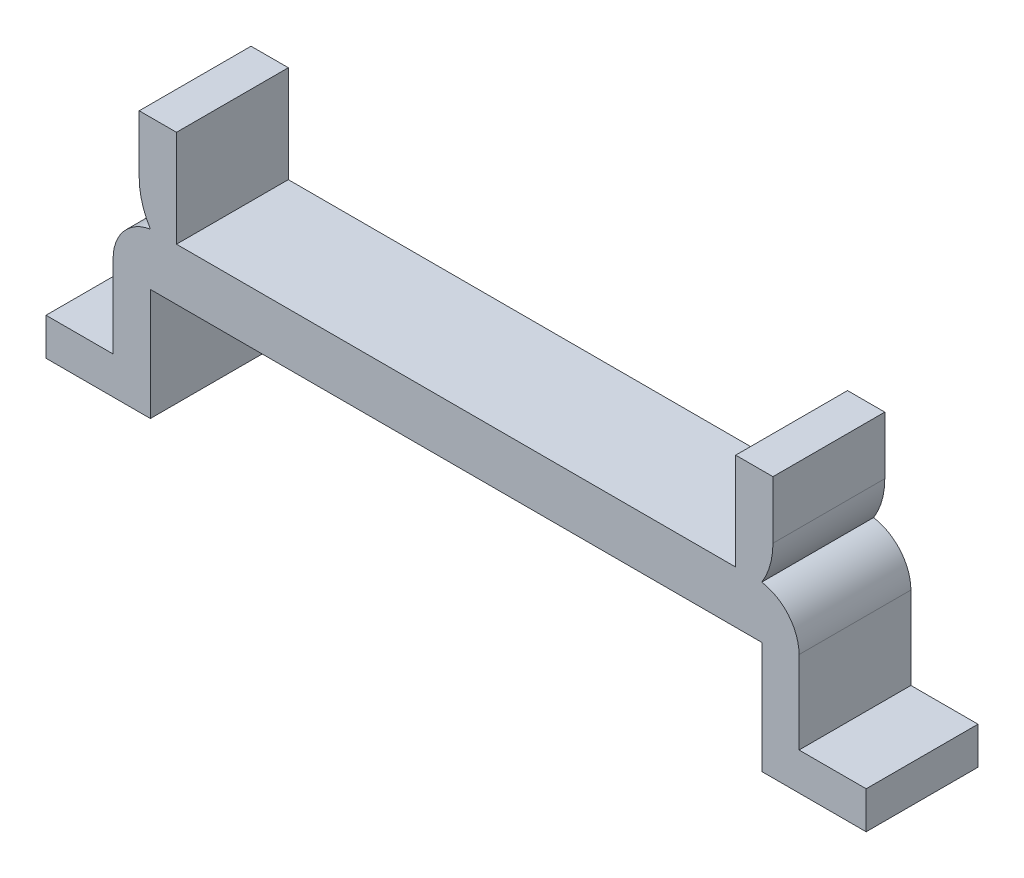
ISO-10303-21;
HEADER;
FILE_DESCRIPTION(('STEP AP214'),'2;1');
FILE_NAME('part.step','',(''),(''),'','','');
FILE_SCHEMA(('AUTOMOTIVE_DESIGN { 1 0 10303 214 1 1 1 1 }'));
ENDSEC;
DATA;
#1=APPLICATION_CONTEXT('core data for automotive mechanical design processes');
#2=APPLICATION_PROTOCOL_DEFINITION('international standard','automotive_design',2000,#1);
#3=PRODUCT_CONTEXT('',#1,'mechanical');
#4=PRODUCT('Part','Part','',(#3));
#5=PRODUCT_RELATED_PRODUCT_CATEGORY('part','',(#4));
#6=PRODUCT_DEFINITION_FORMATION('','',#4);
#7=PRODUCT_DEFINITION_CONTEXT('part definition',#1,'design');
#8=PRODUCT_DEFINITION('design','',#6,#7);
#9=PRODUCT_DEFINITION_SHAPE('','',#8);
#10=(LENGTH_UNIT() NAMED_UNIT(*) SI_UNIT(.MILLI.,.METRE.));
#11=(NAMED_UNIT(*) PLANE_ANGLE_UNIT() SI_UNIT($,.RADIAN.));
#12=(NAMED_UNIT(*) SI_UNIT($,.STERADIAN.) SOLID_ANGLE_UNIT());
#13=UNCERTAINTY_MEASURE_WITH_UNIT(LENGTH_MEASURE(1.E-05),#10,'distance_accuracy_value','');
#14=(GEOMETRIC_REPRESENTATION_CONTEXT(3) GLOBAL_UNCERTAINTY_ASSIGNED_CONTEXT((#13)) GLOBAL_UNIT_ASSIGNED_CONTEXT((#10,
#11,#12)) REPRESENTATION_CONTEXT('',''));
#15=CARTESIAN_POINT('',(0.,0.,0.));
#16=DIRECTION('',(0.,0.,1.));
#17=DIRECTION('',(1.,0.,0.));
#18=AXIS2_PLACEMENT_3D('',#15,#16,#17);
#19=CARTESIAN_POINT('',(-46.,7.,30.061028345357));
#20=DIRECTION('',(-1.,0.,0.));
#21=DIRECTION('',(0.,0.,1.));
#22=AXIS2_PLACEMENT_3D('',#19,#20,#21);
#23=PLANE('',#22);
#24=DIRECTION('',(0.,1.,0.));
#25=VECTOR('',#24,1.);
#26=CARTESIAN_POINT('',(-46.,7.,-7.5));
#27=LINE('',#26,#25);
#28=CARTESIAN_POINT('',(-46.,-10.,-7.5));
#29=VERTEX_POINT('',#28);
#30=CARTESIAN_POINT('',(-46.,1.08392021690038,-7.5));
#31=VERTEX_POINT('',#30);
#32=EDGE_CURVE('E238',#29,#31,#27,.T.);
#33=ORIENTED_EDGE('',*,*,#32,.F.);
#34=DIRECTION('',(0.,0.,-1.));
#35=VECTOR('',#34,1.);
#36=CARTESIAN_POINT('',(-46.,-10.,-7.5));
#37=LINE('',#36,#35);
#38=CARTESIAN_POINT('',(-46.,-10.,7.50000000000001));
#39=VERTEX_POINT('',#38);
#40=EDGE_CURVE('E196',#39,#29,#37,.T.);
#41=ORIENTED_EDGE('',*,*,#40,.F.);
#42=DIRECTION('',(0.,-1.,0.));
#43=VECTOR('',#42,1.);
#44=CARTESIAN_POINT('',(-46.,7.,7.50000000000001));
#45=LINE('',#44,#43);
#46=CARTESIAN_POINT('',(-46.,1.08392021690038,7.50000000000001));
#47=VERTEX_POINT('',#46);
#48=EDGE_CURVE('E239',#47,#39,#45,.T.);
#49=ORIENTED_EDGE('',*,*,#48,.F.);
#50=DIRECTION('',(0.,0.,1.));
#51=VECTOR('',#50,1.);
#52=CARTESIAN_POINT('',(-46.,1.08392021690038,-7.5));
#53=LINE('',#52,#51);
#54=EDGE_CURVE('E11',#47,#31,#53,.F.);
#55=ORIENTED_EDGE('',*,*,#54,.T.);
#56=EDGE_LOOP('',(#33,#41,#49,#55));
#57=FACE_BOUND('',#56,.T.);
#58=ADVANCED_FACE('F37',(#57),#23,.T.);
#59=CARTESIAN_POINT('',(0.,7.,0.));
#60=DIRECTION('',(0.,1.,0.));
#61=DIRECTION('',(0.,0.,1.));
#62=AXIS2_PLACEMENT_3D('',#59,#60,#61);
#63=PLANE('',#62);
#64=DIRECTION('',(1.,0.,0.));
#65=VECTOR('',#64,1.);
#66=CARTESIAN_POINT('',(-41.,7.,7.50000000000001));
#67=LINE('',#66,#65);
#68=CARTESIAN_POINT('',(-37.5,7.,7.50000000000001));
#69=VERTEX_POINT('',#68);
#70=CARTESIAN_POINT('',(37.5,7.,7.5));
#71=VERTEX_POINT('',#70);
#72=EDGE_CURVE('E314',#69,#71,#67,.T.);
#73=ORIENTED_EDGE('',*,*,#72,.T.);
#74=DIRECTION('',(0.,0.,1.));
#75=VECTOR('',#74,1.);
#76=CARTESIAN_POINT('',(37.5,7.,-7.5));
#77=LINE('',#76,#75);
#78=CARTESIAN_POINT('',(37.5,7.,-7.5));
#79=VERTEX_POINT('',#78);
#80=EDGE_CURVE('E275',#79,#71,#77,.T.);
#81=ORIENTED_EDGE('',*,*,#80,.F.);
#82=DIRECTION('',(-1.,0.,0.));
#83=VECTOR('',#82,1.);
#84=CARTESIAN_POINT('',(-41.,7.,-7.5));
#85=LINE('',#84,#83);
#86=CARTESIAN_POINT('',(-37.5,7.,-7.5));
#87=VERTEX_POINT('',#86);
#88=EDGE_CURVE('E320',#79,#87,#85,.T.);
#89=ORIENTED_EDGE('',*,*,#88,.T.);
#90=DIRECTION('',(0.,0.,-1.));
#91=VECTOR('',#90,1.);
#92=CARTESIAN_POINT('',(-37.5,7.,-7.5));
#93=LINE('',#92,#91);
#94=EDGE_CURVE('E278',#69,#87,#93,.T.);
#95=ORIENTED_EDGE('',*,*,#94,.F.);
#96=EDGE_LOOP('',(#73,#81,#89,#95));
#97=FACE_BOUND('',#96,.T.);
#98=ADVANCED_FACE('F378',(#97),#63,.T.);
#99=CARTESIAN_POINT('',(-41.,7.,7.50000000000001));
#100=DIRECTION('',(0.,0.,-1.));
#101=DIRECTION('',(-1.,0.,0.));
#102=AXIS2_PLACEMENT_3D('',#99,#100,#101);
#103=PLANE('',#102);
#104=DIRECTION('',(1.,0.,0.));
#105=VECTOR('',#104,1.);
#106=CARTESIAN_POINT('',(41.,-15.,7.5));
#107=LINE('',#106,#105);
#108=CARTESIAN_POINT('',(41.,-15.,7.5));
#109=VERTEX_POINT('',#108);
#110=CARTESIAN_POINT('',(55.,-15.,7.50000000000001));
#111=VERTEX_POINT('',#110);
#112=EDGE_CURVE('E251',#109,#111,#107,.T.);
#113=ORIENTED_EDGE('',*,*,#112,.T.);
#114=DIRECTION('',(0.,1.,0.));
#115=VECTOR('',#114,1.);
#116=CARTESIAN_POINT('',(55.,-15.,7.50000000000001));
#117=LINE('',#116,#115);
#118=CARTESIAN_POINT('',(55.,-10.,7.50000000000001));
#119=VERTEX_POINT('',#118);
#120=EDGE_CURVE('E209',#111,#119,#117,.T.);
#121=ORIENTED_EDGE('',*,*,#120,.T.);
#122=DIRECTION('',(-1.,0.,0.));
#123=VECTOR('',#122,1.);
#124=CARTESIAN_POINT('',(55.,-10.,7.50000000000001));
#125=LINE('',#124,#123);
#126=CARTESIAN_POINT('',(46.,-10.,7.5));
#127=VERTEX_POINT('',#126);
#128=EDGE_CURVE('E197',#119,#127,#125,.T.);
#129=ORIENTED_EDGE('',*,*,#128,.T.);
#130=DIRECTION('',(0.,1.,0.));
#131=VECTOR('',#130,1.);
#132=CARTESIAN_POINT('',(46.,7.,7.5));
#133=LINE('',#132,#131);
#134=CARTESIAN_POINT('',(46.,1.08392021690038,7.5));
#135=VERTEX_POINT('',#134);
#136=EDGE_CURVE('E52',#127,#135,#133,.T.);
#137=ORIENTED_EDGE('',*,*,#136,.T.);
#138=CARTESIAN_POINT('',(40.,1.08392021690038,7.5));
#139=DIRECTION('',(0.,0.,-1.));
#140=DIRECTION('',(-1.,0.,0.));
#141=AXIS2_PLACEMENT_3D('',#138,#139,#140);
#142=CIRCLE('',#141,6.);
#143=CARTESIAN_POINT('',(41.,7.,7.5));
#144=VERTEX_POINT('',#143);
#145=EDGE_CURVE('E45',#135,#144,#142,.F.);
#146=ORIENTED_EDGE('',*,*,#145,.T.);
#147=CARTESIAN_POINT('',(32.5,12.2678268764264,7.5));
#148=DIRECTION('',(0.,0.,-1.));
#149=DIRECTION('',(-1.,0.,0.));
#150=AXIS2_PLACEMENT_3D('',#147,#148,#149);
#151=CIRCLE('',#150,10.);
#152=CARTESIAN_POINT('',(42.5,12.2678268764264,7.5));
#153=VERTEX_POINT('',#152);
#154=EDGE_CURVE('E339',#144,#153,#151,.F.);
#155=ORIENTED_EDGE('',*,*,#154,.T.);
#156=DIRECTION('',(0.,-1.,0.));
#157=VECTOR('',#156,1.);
#158=CARTESIAN_POINT('',(42.5,20.,7.50000000000001));
#159=LINE('',#158,#157);
#160=CARTESIAN_POINT('',(42.5,20.,7.50000000000001));
#161=VERTEX_POINT('',#160);
#162=EDGE_CURVE('E265',#161,#153,#159,.T.);
#163=ORIENTED_EDGE('',*,*,#162,.F.);
#164=DIRECTION('',(1.,0.,0.));
#165=VECTOR('',#164,1.);
#166=CARTESIAN_POINT('',(37.5,20.,7.50000000000001));
#167=LINE('',#166,#165);
#168=CARTESIAN_POINT('',(37.5,20.,7.50000000000001));
#169=VERTEX_POINT('',#168);
#170=EDGE_CURVE('E283',#169,#161,#167,.T.);
#171=ORIENTED_EDGE('',*,*,#170,.F.);
#172=DIRECTION('',(0.,-1.,0.));
#173=VECTOR('',#172,1.);
#174=CARTESIAN_POINT('',(37.5,20.,7.50000000000001));
#175=LINE('',#174,#173);
#176=EDGE_CURVE('E256',#169,#71,#175,.T.);
#177=ORIENTED_EDGE('',*,*,#176,.T.);
#178=ORIENTED_EDGE('',*,*,#72,.F.);
#179=DIRECTION('',(0.,-1.,0.));
#180=VECTOR('',#179,1.);
#181=CARTESIAN_POINT('',(-37.5,20.,7.50000000000001));
#182=LINE('',#181,#180);
#183=CARTESIAN_POINT('',(-37.5,20.,7.50000000000001));
#184=VERTEX_POINT('',#183);
#185=EDGE_CURVE('E304',#184,#69,#182,.T.);
#186=ORIENTED_EDGE('',*,*,#185,.F.);
#187=DIRECTION('',(1.,0.,0.));
#188=VECTOR('',#187,1.);
#189=CARTESIAN_POINT('',(-42.5,20.,7.50000000000001));
#190=LINE('',#189,#188);
#191=CARTESIAN_POINT('',(-42.5,20.,7.50000000000001));
#192=VERTEX_POINT('',#191);
#193=EDGE_CURVE('E290',#192,#184,#190,.T.);
#194=ORIENTED_EDGE('',*,*,#193,.F.);
#195=DIRECTION('',(0.,-1.,0.));
#196=VECTOR('',#195,1.);
#197=CARTESIAN_POINT('',(-42.5,20.,7.50000000000001));
#198=LINE('',#197,#196);
#199=CARTESIAN_POINT('',(-42.5,12.2678268764264,7.50000000000001));
#200=VERTEX_POINT('',#199);
#201=EDGE_CURVE('E307',#192,#200,#198,.T.);
#202=ORIENTED_EDGE('',*,*,#201,.T.);
#203=CARTESIAN_POINT('',(-32.5,12.2678268764264,7.50000000000001));
#204=DIRECTION('',(0.,0.,-1.));
#205=DIRECTION('',(-1.,0.,0.));
#206=AXIS2_PLACEMENT_3D('',#203,#204,#205);
#207=CIRCLE('',#206,10.);
#208=CARTESIAN_POINT('',(-41.,7.,7.50000000000001));
#209=VERTEX_POINT('',#208);
#210=EDGE_CURVE('E337',#200,#209,#207,.F.);
#211=ORIENTED_EDGE('',*,*,#210,.T.);
#212=CARTESIAN_POINT('',(-40.,1.08392021690038,7.50000000000001));
#213=DIRECTION('',(0.,0.,-1.));
#214=DIRECTION('',(-1.,0.,0.));
#215=AXIS2_PLACEMENT_3D('',#212,#213,#214);
#216=CIRCLE('',#215,6.);
#217=EDGE_CURVE('E350',#209,#47,#216,.F.);
#218=ORIENTED_EDGE('',*,*,#217,.T.);
#219=ORIENTED_EDGE('',*,*,#48,.T.);
#220=DIRECTION('',(1.,0.,0.));
#221=VECTOR('',#220,1.);
#222=CARTESIAN_POINT('',(-55.,-10.,7.50000000000001));
#223=LINE('',#222,#221);
#224=CARTESIAN_POINT('',(-55.,-10.,7.50000000000001));
#225=VERTEX_POINT('',#224);
#226=EDGE_CURVE('E230',#225,#39,#223,.T.);
#227=ORIENTED_EDGE('',*,*,#226,.F.);
#228=DIRECTION('',(0.,1.,0.));
#229=VECTOR('',#228,1.);
#230=CARTESIAN_POINT('',(-55.,-15.,7.50000000000001));
#231=LINE('',#230,#229);
#232=CARTESIAN_POINT('',(-55.,-15.,7.50000000000001));
#233=VERTEX_POINT('',#232);
#234=EDGE_CURVE('E222',#233,#225,#231,.T.);
#235=ORIENTED_EDGE('',*,*,#234,.F.);
#236=DIRECTION('',(1.,0.,0.));
#237=VECTOR('',#236,1.);
#238=CARTESIAN_POINT('',(-41.,-15.,7.50000000000001));
#239=LINE('',#238,#237);
#240=CARTESIAN_POINT('',(-41.,-15.,7.50000000000001));
#241=VERTEX_POINT('',#240);
#242=EDGE_CURVE('E232',#233,#241,#239,.T.);
#243=ORIENTED_EDGE('',*,*,#242,.T.);
#244=DIRECTION('',(0.,1.,0.));
#245=VECTOR('',#244,1.);
#246=CARTESIAN_POINT('',(-41.,7.,7.50000000000001));
#247=LINE('',#246,#245);
#248=CARTESIAN_POINT('',(-41.,0.,7.50000000000001));
#249=VERTEX_POINT('',#248);
#250=EDGE_CURVE('E234',#241,#249,#247,.T.);
#251=ORIENTED_EDGE('',*,*,#250,.T.);
#252=DIRECTION('',(1.,0.,0.));
#253=VECTOR('',#252,1.);
#254=CARTESIAN_POINT('',(-41.,0.,7.50000000000001));
#255=LINE('',#254,#253);
#256=CARTESIAN_POINT('',(41.,0.,7.5));
#257=VERTEX_POINT('',#256);
#258=EDGE_CURVE('E324',#249,#257,#255,.T.);
#259=ORIENTED_EDGE('',*,*,#258,.T.);
#260=DIRECTION('',(0.,-1.,0.));
#261=VECTOR('',#260,1.);
#262=CARTESIAN_POINT('',(41.,7.,7.5));
#263=LINE('',#262,#261);
#264=EDGE_CURVE('E254',#257,#109,#263,.T.);
#265=ORIENTED_EDGE('',*,*,#264,.T.);
#266=EDGE_LOOP('',(#113,#121,#129,#137,#146,#155,#163,#171,#177,#178,#186,#194,#202,#211,#218,
#219,#227,#235,#243,#251,#259,#265));
#267=FACE_BOUND('',#266,.T.);
#268=ADVANCED_FACE('F354',(#267),#103,.F.);
#269=CARTESIAN_POINT('',(-41.,7.,-7.5));
#270=DIRECTION('',(0.,0.,1.));
#271=DIRECTION('',(1.,0.,0.));
#272=AXIS2_PLACEMENT_3D('',#269,#270,#271);
#273=PLANE('',#272);
#274=CARTESIAN_POINT('',(32.5,12.2678268764264,-7.5));
#275=DIRECTION('',(0.,0.,1.));
#276=DIRECTION('',(1.,0.,0.));
#277=AXIS2_PLACEMENT_3D('',#274,#275,#276);
#278=CIRCLE('',#277,10.);
#279=CARTESIAN_POINT('',(42.5,12.2678268764264,-7.5));
#280=VERTEX_POINT('',#279);
#281=CARTESIAN_POINT('',(41.,7.,-7.5));
#282=VERTEX_POINT('',#281);
#283=EDGE_CURVE('E335',#280,#282,#278,.F.);
#284=ORIENTED_EDGE('',*,*,#283,.T.);
#285=CARTESIAN_POINT('',(40.,1.08392021690038,-7.5));
#286=DIRECTION('',(0.,0.,1.));
#287=DIRECTION('',(1.,0.,0.));
#288=AXIS2_PLACEMENT_3D('',#285,#286,#287);
#289=CIRCLE('',#288,6.);
#290=CARTESIAN_POINT('',(46.,1.08392021690038,-7.5));
#291=VERTEX_POINT('',#290);
#292=EDGE_CURVE('E346',#282,#291,#289,.F.);
#293=ORIENTED_EDGE('',*,*,#292,.T.);
#294=DIRECTION('',(0.,-1.,0.));
#295=VECTOR('',#294,1.);
#296=CARTESIAN_POINT('',(46.,7.,-7.5));
#297=LINE('',#296,#295);
#298=CARTESIAN_POINT('',(46.,-10.,-7.5));
#299=VERTEX_POINT('',#298);
#300=EDGE_CURVE('E193',#291,#299,#297,.T.);
#301=ORIENTED_EDGE('',*,*,#300,.T.);
#302=DIRECTION('',(-1.,0.,0.));
#303=VECTOR('',#302,1.);
#304=CARTESIAN_POINT('',(55.,-10.,-7.5));
#305=LINE('',#304,#303);
#306=CARTESIAN_POINT('',(55.,-10.,-7.5));
#307=VERTEX_POINT('',#306);
#308=EDGE_CURVE('E186',#307,#299,#305,.T.);
#309=ORIENTED_EDGE('',*,*,#308,.F.);
#310=DIRECTION('',(0.,-1.,0.));
#311=VECTOR('',#310,1.);
#312=CARTESIAN_POINT('',(55.,-15.,-7.5));
#313=LINE('',#312,#311);
#314=CARTESIAN_POINT('',(55.,-15.,-7.5));
#315=VERTEX_POINT('',#314);
#316=EDGE_CURVE('E191',#307,#315,#313,.T.);
#317=ORIENTED_EDGE('',*,*,#316,.T.);
#318=DIRECTION('',(-1.,0.,0.));
#319=VECTOR('',#318,1.);
#320=CARTESIAN_POINT('',(41.,-15.,-7.5));
#321=LINE('',#320,#319);
#322=CARTESIAN_POINT('',(41.,-15.,-7.5));
#323=VERTEX_POINT('',#322);
#324=EDGE_CURVE('E260',#315,#323,#321,.T.);
#325=ORIENTED_EDGE('',*,*,#324,.T.);
#326=DIRECTION('',(0.,1.,0.));
#327=VECTOR('',#326,1.);
#328=CARTESIAN_POINT('',(41.,7.,-7.5));
#329=LINE('',#328,#327);
#330=CARTESIAN_POINT('',(41.,0.,-7.5));
#331=VERTEX_POINT('',#330);
#332=EDGE_CURVE('E245',#323,#331,#329,.T.);
#333=ORIENTED_EDGE('',*,*,#332,.T.);
#334=DIRECTION('',(-1.,0.,0.));
#335=VECTOR('',#334,1.);
#336=CARTESIAN_POINT('',(-41.,0.,-7.5));
#337=LINE('',#336,#335);
#338=CARTESIAN_POINT('',(-41.,0.,-7.5));
#339=VERTEX_POINT('',#338);
#340=EDGE_CURVE('E315',#331,#339,#337,.T.);
#341=ORIENTED_EDGE('',*,*,#340,.T.);
#342=DIRECTION('',(0.,-1.,0.));
#343=VECTOR('',#342,1.);
#344=CARTESIAN_POINT('',(-41.,7.,-7.5));
#345=LINE('',#344,#343);
#346=CARTESIAN_POINT('',(-41.,-15.,-7.5));
#347=VERTEX_POINT('',#346);
#348=EDGE_CURVE('E243',#339,#347,#345,.T.);
#349=ORIENTED_EDGE('',*,*,#348,.T.);
#350=DIRECTION('',(-1.,0.,0.));
#351=VECTOR('',#350,1.);
#352=CARTESIAN_POINT('',(-41.,-15.,-7.5));
#353=LINE('',#352,#351);
#354=CARTESIAN_POINT('',(-55.,-15.,-7.5));
#355=VERTEX_POINT('',#354);
#356=EDGE_CURVE('E241',#347,#355,#353,.T.);
#357=ORIENTED_EDGE('',*,*,#356,.T.);
#358=DIRECTION('',(0.,-1.,0.));
#359=VECTOR('',#358,1.);
#360=CARTESIAN_POINT('',(-55.,-15.,-7.5));
#361=LINE('',#360,#359);
#362=CARTESIAN_POINT('',(-55.,-10.,-7.5));
#363=VERTEX_POINT('',#362);
#364=EDGE_CURVE('E216',#363,#355,#361,.T.);
#365=ORIENTED_EDGE('',*,*,#364,.F.);
#366=DIRECTION('',(1.,0.,0.));
#367=VECTOR('',#366,1.);
#368=CARTESIAN_POINT('',(-55.,-10.,-7.5));
#369=LINE('',#368,#367);
#370=EDGE_CURVE('E226',#363,#29,#369,.T.);
#371=ORIENTED_EDGE('',*,*,#370,.T.);
#372=ORIENTED_EDGE('',*,*,#32,.T.);
#373=CARTESIAN_POINT('',(-40.,1.08392021690038,-7.5));
#374=DIRECTION('',(0.,0.,1.));
#375=DIRECTION('',(1.,0.,0.));
#376=AXIS2_PLACEMENT_3D('',#373,#374,#375);
#377=CIRCLE('',#376,6.);
#378=CARTESIAN_POINT('',(-41.,7.,-7.5));
#379=VERTEX_POINT('',#378);
#380=EDGE_CURVE('E344',#31,#379,#377,.F.);
#381=ORIENTED_EDGE('',*,*,#380,.T.);
#382=CARTESIAN_POINT('',(-32.5,12.2678268764264,-7.5));
#383=DIRECTION('',(0.,0.,1.));
#384=DIRECTION('',(1.,0.,0.));
#385=AXIS2_PLACEMENT_3D('',#382,#383,#384);
#386=CIRCLE('',#385,10.);
#387=CARTESIAN_POINT('',(-42.5,12.2678268764264,-7.5));
#388=VERTEX_POINT('',#387);
#389=EDGE_CURVE('E333',#379,#388,#386,.F.);
#390=ORIENTED_EDGE('',*,*,#389,.T.);
#391=DIRECTION('',(0.,-1.,0.));
#392=VECTOR('',#391,1.);
#393=CARTESIAN_POINT('',(-42.5,20.,-7.5));
#394=LINE('',#393,#392);
#395=CARTESIAN_POINT('',(-42.5,20.,-7.5));
#396=VERTEX_POINT('',#395);
#397=EDGE_CURVE('E296',#396,#388,#394,.T.);
#398=ORIENTED_EDGE('',*,*,#397,.F.);
#399=DIRECTION('',(-1.,0.,0.));
#400=VECTOR('',#399,1.);
#401=CARTESIAN_POINT('',(-42.5,20.,-7.5));
#402=LINE('',#401,#400);
#403=CARTESIAN_POINT('',(-37.5,20.,-7.5));
#404=VERTEX_POINT('',#403);
#405=EDGE_CURVE('E294',#404,#396,#402,.T.);
#406=ORIENTED_EDGE('',*,*,#405,.F.);
#407=DIRECTION('',(0.,-1.,0.));
#408=VECTOR('',#407,1.);
#409=CARTESIAN_POINT('',(-37.5,20.,-7.5));
#410=LINE('',#409,#408);
#411=EDGE_CURVE('E301',#404,#87,#410,.T.);
#412=ORIENTED_EDGE('',*,*,#411,.T.);
#413=ORIENTED_EDGE('',*,*,#88,.F.);
#414=DIRECTION('',(0.,-1.,0.));
#415=VECTOR('',#414,1.);
#416=CARTESIAN_POINT('',(37.5,20.,-7.5));
#417=LINE('',#416,#415);
#418=CARTESIAN_POINT('',(37.5,20.,-7.5));
#419=VERTEX_POINT('',#418);
#420=EDGE_CURVE('E271',#419,#79,#417,.T.);
#421=ORIENTED_EDGE('',*,*,#420,.F.);
#422=DIRECTION('',(-1.,0.,0.));
#423=VECTOR('',#422,1.);
#424=CARTESIAN_POINT('',(37.5,20.,-7.5));
#425=LINE('',#424,#423);
#426=CARTESIAN_POINT('',(42.5,20.,-7.5));
#427=VERTEX_POINT('',#426);
#428=EDGE_CURVE('E274',#427,#419,#425,.T.);
#429=ORIENTED_EDGE('',*,*,#428,.F.);
#430=DIRECTION('',(0.,-1.,0.));
#431=VECTOR('',#430,1.);
#432=CARTESIAN_POINT('',(42.5,20.,-7.5));
#433=LINE('',#432,#431);
#434=EDGE_CURVE('E268',#427,#280,#433,.T.);
#435=ORIENTED_EDGE('',*,*,#434,.T.);
#436=EDGE_LOOP('',(#284,#293,#301,#309,#317,#325,#333,#341,#349,#357,#365,#371,#372,#381,#390,
#398,#406,#412,#413,#421,#429,#435));
#437=FACE_BOUND('',#436,.T.);
#438=ADVANCED_FACE('F189',(#437),#273,.F.);
#439=CARTESIAN_POINT('',(0.,0.,0.));
#440=DIRECTION('',(0.,1.,0.));
#441=DIRECTION('',(0.,0.,1.));
#442=AXIS2_PLACEMENT_3D('',#439,#440,#441);
#443=PLANE('',#442);
#444=DIRECTION('',(0.,0.,1.));
#445=VECTOR('',#444,1.);
#446=CARTESIAN_POINT('',(-41.,0.,-7.5));
#447=LINE('',#446,#445);
#448=EDGE_CURVE('E310',#339,#249,#447,.T.);
#449=ORIENTED_EDGE('',*,*,#448,.F.);
#450=ORIENTED_EDGE('',*,*,#340,.F.);
#451=DIRECTION('',(0.,0.,-1.));
#452=VECTOR('',#451,1.);
#453=CARTESIAN_POINT('',(41.,0.,-7.5));
#454=LINE('',#453,#452);
#455=EDGE_CURVE('E327',#257,#331,#454,.T.);
#456=ORIENTED_EDGE('',*,*,#455,.F.);
#457=ORIENTED_EDGE('',*,*,#258,.F.);
#458=EDGE_LOOP('',(#449,#450,#456,#457));
#459=FACE_BOUND('',#458,.T.);
#460=ADVANCED_FACE('F460',(#459),#443,.F.);
#461=CARTESIAN_POINT('',(-42.5,20.,-7.5));
#462=DIRECTION('',(1.,0.,0.));
#463=DIRECTION('',(0.,0.,-1.));
#464=AXIS2_PLACEMENT_3D('',#461,#462,#463);
#465=PLANE('',#464);
#466=ORIENTED_EDGE('',*,*,#397,.T.);
#467=DIRECTION('',(0.,0.,-1.));
#468=VECTOR('',#467,1.);
#469=CARTESIAN_POINT('',(-42.5,12.2678268764264,-7.5));
#470=LINE('',#469,#468);
#471=EDGE_CURVE('E341',#388,#200,#470,.F.);
#472=ORIENTED_EDGE('',*,*,#471,.T.);
#473=ORIENTED_EDGE('',*,*,#201,.F.);
#474=DIRECTION('',(0.,0.,1.));
#475=VECTOR('',#474,1.);
#476=CARTESIAN_POINT('',(-42.5,20.,-7.5));
#477=LINE('',#476,#475);
#478=EDGE_CURVE('E287',#396,#192,#477,.T.);
#479=ORIENTED_EDGE('',*,*,#478,.F.);
#480=EDGE_LOOP('',(#466,#472,#473,#479));
#481=FACE_BOUND('',#480,.T.);
#482=ADVANCED_FACE('F391',(#481),#465,.F.);
#483=CARTESIAN_POINT('',(-37.5,20.,-7.5));
#484=DIRECTION('',(-1.,0.,0.));
#485=DIRECTION('',(0.,0.,1.));
#486=AXIS2_PLACEMENT_3D('',#483,#484,#485);
#487=PLANE('',#486);
#488=ORIENTED_EDGE('',*,*,#94,.T.);
#489=ORIENTED_EDGE('',*,*,#411,.F.);
#490=DIRECTION('',(0.,0.,-1.));
#491=VECTOR('',#490,1.);
#492=CARTESIAN_POINT('',(-37.5,20.,-7.5));
#493=LINE('',#492,#491);
#494=EDGE_CURVE('E292',#184,#404,#493,.T.);
#495=ORIENTED_EDGE('',*,*,#494,.F.);
#496=ORIENTED_EDGE('',*,*,#185,.T.);
#497=EDGE_LOOP('',(#488,#489,#495,#496));
#498=FACE_BOUND('',#497,.T.);
#499=ADVANCED_FACE('F382',(#498),#487,.F.);
#500=CARTESIAN_POINT('',(0.,20.,0.));
#501=DIRECTION('',(0.,1.,0.));
#502=DIRECTION('',(0.,0.,1.));
#503=AXIS2_PLACEMENT_3D('',#500,#501,#502);
#504=PLANE('',#503);
#505=ORIENTED_EDGE('',*,*,#478,.T.);
#506=ORIENTED_EDGE('',*,*,#193,.T.);
#507=ORIENTED_EDGE('',*,*,#494,.T.);
#508=ORIENTED_EDGE('',*,*,#405,.T.);
#509=EDGE_LOOP('',(#505,#506,#507,#508));
#510=FACE_BOUND('',#509,.T.);
#511=ADVANCED_FACE('F386',(#510),#504,.T.);
#512=CARTESIAN_POINT('',(37.5,20.,-7.5));
#513=DIRECTION('',(1.,0.,0.));
#514=DIRECTION('',(0.,0.,-1.));
#515=AXIS2_PLACEMENT_3D('',#512,#513,#514);
#516=PLANE('',#515);
#517=ORIENTED_EDGE('',*,*,#80,.T.);
#518=ORIENTED_EDGE('',*,*,#176,.F.);
#519=DIRECTION('',(0.,0.,1.));
#520=VECTOR('',#519,1.);
#521=CARTESIAN_POINT('',(37.5,20.,-7.5));
#522=LINE('',#521,#520);
#523=EDGE_CURVE('E279',#419,#169,#522,.T.);
#524=ORIENTED_EDGE('',*,*,#523,.F.);
#525=ORIENTED_EDGE('',*,*,#420,.T.);
#526=EDGE_LOOP('',(#517,#518,#524,#525));
#527=FACE_BOUND('',#526,.T.);
#528=ADVANCED_FACE('F375',(#527),#516,.F.);
#529=CARTESIAN_POINT('',(42.5,20.,-7.5));
#530=DIRECTION('',(-1.,0.,0.));
#531=DIRECTION('',(0.,0.,1.));
#532=AXIS2_PLACEMENT_3D('',#529,#530,#531);
#533=PLANE('',#532);
#534=ORIENTED_EDGE('',*,*,#162,.T.);
#535=DIRECTION('',(0.,0.,1.));
#536=VECTOR('',#535,1.);
#537=CARTESIAN_POINT('',(42.5,12.2678268764264,-7.5));
#538=LINE('',#537,#536);
#539=EDGE_CURVE('E322',#153,#280,#538,.F.);
#540=ORIENTED_EDGE('',*,*,#539,.T.);
#541=ORIENTED_EDGE('',*,*,#434,.F.);
#542=DIRECTION('',(0.,0.,-1.));
#543=VECTOR('',#542,1.);
#544=CARTESIAN_POINT('',(42.5,20.,-7.5));
#545=LINE('',#544,#543);
#546=EDGE_CURVE('E281',#161,#427,#545,.T.);
#547=ORIENTED_EDGE('',*,*,#546,.F.);
#548=EDGE_LOOP('',(#534,#540,#541,#547));
#549=FACE_BOUND('',#548,.T.);
#550=ADVANCED_FACE('F366',(#549),#533,.F.);
#551=CARTESIAN_POINT('',(0.,20.,0.));
#552=DIRECTION('',(0.,1.,0.));
#553=DIRECTION('',(0.,0.,1.));
#554=AXIS2_PLACEMENT_3D('',#551,#552,#553);
#555=PLANE('',#554);
#556=ORIENTED_EDGE('',*,*,#523,.T.);
#557=ORIENTED_EDGE('',*,*,#170,.T.);
#558=ORIENTED_EDGE('',*,*,#546,.T.);
#559=ORIENTED_EDGE('',*,*,#428,.T.);
#560=EDGE_LOOP('',(#556,#557,#558,#559));
#561=FACE_BOUND('',#560,.T.);
#562=ADVANCED_FACE('F372',(#561),#555,.T.);
#563=CARTESIAN_POINT('',(32.5,12.2678268764264,0.));
#564=DIRECTION('',(0.,0.,1.));
#565=DIRECTION('',(1.,0.,0.));
#566=AXIS2_PLACEMENT_3D('',#563,#564,#565);
#567=CYLINDRICAL_SURFACE('',#566,10.);
#568=ORIENTED_EDGE('',*,*,#154,.F.);
#569=DIRECTION('',(0.,0.,-1.));
#570=VECTOR('',#569,1.);
#571=CARTESIAN_POINT('',(41.,7.,-7.5));
#572=LINE('',#571,#570);
#573=EDGE_CURVE('E317',#144,#282,#572,.T.);
#574=ORIENTED_EDGE('',*,*,#573,.T.);
#575=ORIENTED_EDGE('',*,*,#283,.F.);
#576=ORIENTED_EDGE('',*,*,#539,.F.);
#577=EDGE_LOOP('',(#568,#574,#575,#576));
#578=FACE_BOUND('',#577,.T.);
#579=ADVANCED_FACE('F361',(#578),#567,.T.);
#580=CARTESIAN_POINT('',(-32.5,12.2678268764264,0.));
#581=DIRECTION('',(0.,0.,-1.));
#582=DIRECTION('',(-1.,0.,0.));
#583=AXIS2_PLACEMENT_3D('',#580,#581,#582);
#584=CYLINDRICAL_SURFACE('',#583,10.);
#585=ORIENTED_EDGE('',*,*,#389,.F.);
#586=DIRECTION('',(0.,0.,1.));
#587=VECTOR('',#586,1.);
#588=CARTESIAN_POINT('',(-41.,7.,-7.5));
#589=LINE('',#588,#587);
#590=EDGE_CURVE('E311',#379,#209,#589,.T.);
#591=ORIENTED_EDGE('',*,*,#590,.T.);
#592=ORIENTED_EDGE('',*,*,#210,.F.);
#593=ORIENTED_EDGE('',*,*,#471,.F.);
#594=EDGE_LOOP('',(#585,#591,#592,#593));
#595=FACE_BOUND('',#594,.T.);
#596=ADVANCED_FACE('F395',(#595),#584,.T.);
#597=CARTESIAN_POINT('',(41.,7.,30.061028345357));
#598=DIRECTION('',(-1.,0.,0.));
#599=DIRECTION('',(0.,0.,1.));
#600=AXIS2_PLACEMENT_3D('',#597,#598,#599);
#601=PLANE('',#600);
#602=ORIENTED_EDGE('',*,*,#455,.T.);
#603=ORIENTED_EDGE('',*,*,#332,.F.);
#604=DIRECTION('',(0.,0.,-1.));
#605=VECTOR('',#604,1.);
#606=CARTESIAN_POINT('',(41.,-15.,30.061028345357));
#607=LINE('',#606,#605);
#608=EDGE_CURVE('E252',#109,#323,#607,.T.);
#609=ORIENTED_EDGE('',*,*,#608,.F.);
#610=ORIENTED_EDGE('',*,*,#264,.F.);
#611=EDGE_LOOP('',(#602,#603,#609,#610));
#612=FACE_BOUND('',#611,.T.);
#613=ADVANCED_FACE('F442',(#612),#601,.T.);
#614=CARTESIAN_POINT('',(41.,-15.,30.061028345357));
#615=DIRECTION('',(0.,-1.,0.));
#616=DIRECTION('',(0.,0.,-1.));
#617=AXIS2_PLACEMENT_3D('',#614,#615,#616);
#618=PLANE('',#617);
#619=ORIENTED_EDGE('',*,*,#112,.F.);
#620=ORIENTED_EDGE('',*,*,#608,.T.);
#621=ORIENTED_EDGE('',*,*,#324,.F.);
#622=DIRECTION('',(0.,0.,1.));
#623=VECTOR('',#622,1.);
#624=CARTESIAN_POINT('',(55.,-15.,-7.5));
#625=LINE('',#624,#623);
#626=EDGE_CURVE('E206',#315,#111,#625,.T.);
#627=ORIENTED_EDGE('',*,*,#626,.T.);
#628=EDGE_LOOP('',(#619,#620,#621,#627));
#629=FACE_BOUND('',#628,.T.);
#630=ADVANCED_FACE('F439',(#629),#618,.T.);
#631=CARTESIAN_POINT('',(46.,7.,30.061028345357));
#632=DIRECTION('',(1.,0.,0.));
#633=DIRECTION('',(0.,0.,-1.));
#634=AXIS2_PLACEMENT_3D('',#631,#632,#633);
#635=PLANE('',#634);
#636=DIRECTION('',(0.,0.,-1.));
#637=VECTOR('',#636,1.);
#638=CARTESIAN_POINT('',(46.,-10.,-7.5));
#639=LINE('',#638,#637);
#640=EDGE_CURVE('E57',#127,#299,#639,.T.);
#641=ORIENTED_EDGE('',*,*,#640,.T.);
#642=ORIENTED_EDGE('',*,*,#300,.F.);
#643=DIRECTION('',(0.,0.,-1.));
#644=VECTOR('',#643,1.);
#645=CARTESIAN_POINT('',(46.,1.08392021690038,7.5));
#646=LINE('',#645,#644);
#647=EDGE_CURVE('E348',#291,#135,#646,.F.);
#648=ORIENTED_EDGE('',*,*,#647,.T.);
#649=ORIENTED_EDGE('',*,*,#136,.F.);
#650=EDGE_LOOP('',(#641,#642,#648,#649));
#651=FACE_BOUND('',#650,.T.);
#652=ADVANCED_FACE('F430',(#651),#635,.T.);
#653=CARTESIAN_POINT('',(-41.,7.,30.061028345357));
#654=DIRECTION('',(1.,0.,0.));
#655=DIRECTION('',(0.,0.,-1.));
#656=AXIS2_PLACEMENT_3D('',#653,#654,#655);
#657=PLANE('',#656);
#658=ORIENTED_EDGE('',*,*,#448,.T.);
#659=ORIENTED_EDGE('',*,*,#250,.F.);
#660=DIRECTION('',(0.,0.,-1.));
#661=VECTOR('',#660,1.);
#662=CARTESIAN_POINT('',(-41.,-15.,30.061028345357));
#663=LINE('',#662,#661);
#664=EDGE_CURVE('E235',#241,#347,#663,.T.);
#665=ORIENTED_EDGE('',*,*,#664,.T.);
#666=ORIENTED_EDGE('',*,*,#348,.F.);
#667=EDGE_LOOP('',(#658,#659,#665,#666));
#668=FACE_BOUND('',#667,.T.);
#669=ADVANCED_FACE('F421',(#668),#657,.T.);
#670=CARTESIAN_POINT('',(-41.,-15.,30.061028345357));
#671=DIRECTION('',(0.,-1.,0.));
#672=DIRECTION('',(0.,0.,-1.));
#673=AXIS2_PLACEMENT_3D('',#670,#671,#672);
#674=PLANE('',#673);
#675=ORIENTED_EDGE('',*,*,#242,.F.);
#676=DIRECTION('',(0.,0.,1.));
#677=VECTOR('',#676,1.);
#678=CARTESIAN_POINT('',(-55.,-15.,-7.5));
#679=LINE('',#678,#677);
#680=EDGE_CURVE('E219',#355,#233,#679,.T.);
#681=ORIENTED_EDGE('',*,*,#680,.F.);
#682=ORIENTED_EDGE('',*,*,#356,.F.);
#683=ORIENTED_EDGE('',*,*,#664,.F.);
#684=EDGE_LOOP('',(#675,#681,#682,#683));
#685=FACE_BOUND('',#684,.T.);
#686=ADVANCED_FACE('F423',(#685),#674,.T.);
#687=CARTESIAN_POINT('',(40.,1.08392021690038,0.));
#688=DIRECTION('',(0.,0.,1.));
#689=DIRECTION('',(1.,0.,0.));
#690=AXIS2_PLACEMENT_3D('',#687,#688,#689);
#691=CYLINDRICAL_SURFACE('',#690,6.);
#692=ORIENTED_EDGE('',*,*,#145,.F.);
#693=ORIENTED_EDGE('',*,*,#647,.F.);
#694=ORIENTED_EDGE('',*,*,#292,.F.);
#695=ORIENTED_EDGE('',*,*,#573,.F.);
#696=EDGE_LOOP('',(#692,#693,#694,#695));
#697=FACE_BOUND('',#696,.T.);
#698=ADVANCED_FACE('F362',(#697),#691,.T.);
#699=CARTESIAN_POINT('',(-40.,1.08392021690038,0.));
#700=DIRECTION('',(0.,0.,-1.));
#701=DIRECTION('',(-1.,0.,0.));
#702=AXIS2_PLACEMENT_3D('',#699,#700,#701);
#703=CYLINDRICAL_SURFACE('',#702,6.);
#704=ORIENTED_EDGE('',*,*,#217,.F.);
#705=ORIENTED_EDGE('',*,*,#590,.F.);
#706=ORIENTED_EDGE('',*,*,#380,.F.);
#707=ORIENTED_EDGE('',*,*,#54,.F.);
#708=EDGE_LOOP('',(#704,#705,#706,#707));
#709=FACE_BOUND('',#708,.T.);
#710=ADVANCED_FACE('F39',(#709),#703,.T.);
#711=CARTESIAN_POINT('',(-55.,-10.,-7.5));
#712=DIRECTION('',(0.,-1.,0.));
#713=DIRECTION('',(0.,0.,-1.));
#714=AXIS2_PLACEMENT_3D('',#711,#712,#713);
#715=PLANE('',#714);
#716=ORIENTED_EDGE('',*,*,#40,.T.);
#717=ORIENTED_EDGE('',*,*,#370,.F.);
#718=DIRECTION('',(0.,0.,-1.));
#719=VECTOR('',#718,1.);
#720=CARTESIAN_POINT('',(-55.,-10.,-7.5));
#721=LINE('',#720,#719);
#722=EDGE_CURVE('E224',#225,#363,#721,.T.);
#723=ORIENTED_EDGE('',*,*,#722,.F.);
#724=ORIENTED_EDGE('',*,*,#226,.T.);
#725=EDGE_LOOP('',(#716,#717,#723,#724));
#726=FACE_BOUND('',#725,.T.);
#727=ADVANCED_FACE('F408',(#726),#715,.F.);
#728=CARTESIAN_POINT('',(-55.,0.,0.));
#729=DIRECTION('',(1.,0.,0.));
#730=DIRECTION('',(0.,0.,-1.));
#731=AXIS2_PLACEMENT_3D('',#728,#729,#730);
#732=PLANE('',#731);
#733=ORIENTED_EDGE('',*,*,#364,.T.);
#734=ORIENTED_EDGE('',*,*,#680,.T.);
#735=ORIENTED_EDGE('',*,*,#234,.T.);
#736=ORIENTED_EDGE('',*,*,#722,.T.);
#737=EDGE_LOOP('',(#733,#734,#735,#736));
#738=FACE_BOUND('',#737,.T.);
#739=ADVANCED_FACE('F414',(#738),#732,.F.);
#740=CARTESIAN_POINT('',(55.,-10.,-7.5));
#741=DIRECTION('',(0.,1.,0.));
#742=DIRECTION('',(0.,0.,1.));
#743=AXIS2_PLACEMENT_3D('',#740,#741,#742);
#744=PLANE('',#743);
#745=ORIENTED_EDGE('',*,*,#640,.F.);
#746=ORIENTED_EDGE('',*,*,#128,.F.);
#747=DIRECTION('',(0.,0.,-1.));
#748=VECTOR('',#747,1.);
#749=CARTESIAN_POINT('',(55.,-10.,-7.5));
#750=LINE('',#749,#748);
#751=EDGE_CURVE('E203',#119,#307,#750,.T.);
#752=ORIENTED_EDGE('',*,*,#751,.T.);
#753=ORIENTED_EDGE('',*,*,#308,.T.);
#754=EDGE_LOOP('',(#745,#746,#752,#753));
#755=FACE_BOUND('',#754,.T.);
#756=ADVANCED_FACE('F208',(#755),#744,.T.);
#757=CARTESIAN_POINT('',(55.,0.,0.));
#758=DIRECTION('',(-1.,0.,0.));
#759=DIRECTION('',(0.,0.,-1.));
#760=AXIS2_PLACEMENT_3D('',#757,#758,#759);
#761=PLANE('',#760);
#762=ORIENTED_EDGE('',*,*,#316,.F.);
#763=ORIENTED_EDGE('',*,*,#751,.F.);
#764=ORIENTED_EDGE('',*,*,#120,.F.);
#765=ORIENTED_EDGE('',*,*,#626,.F.);
#766=EDGE_LOOP('',(#762,#763,#764,#765));
#767=FACE_BOUND('',#766,.T.);
#768=ADVANCED_FACE('F201',(#767),#761,.F.);
#769=CLOSED_SHELL('',(#58,#98,#268,#438,#460,#482,#499,#511,#528,#550,#562,#579,#596,#613,#630,
#652,#669,#686,#698,#710,#727,#739,#756,#768));
#770=MANIFOLD_SOLID_BREP('B2',#769);
#771=ADVANCED_BREP_SHAPE_REPRESENTATION('',(#18,#770),#14);
#772=SHAPE_DEFINITION_REPRESENTATION(#9,#771);
ENDSEC;
END-ISO-10303-21;
